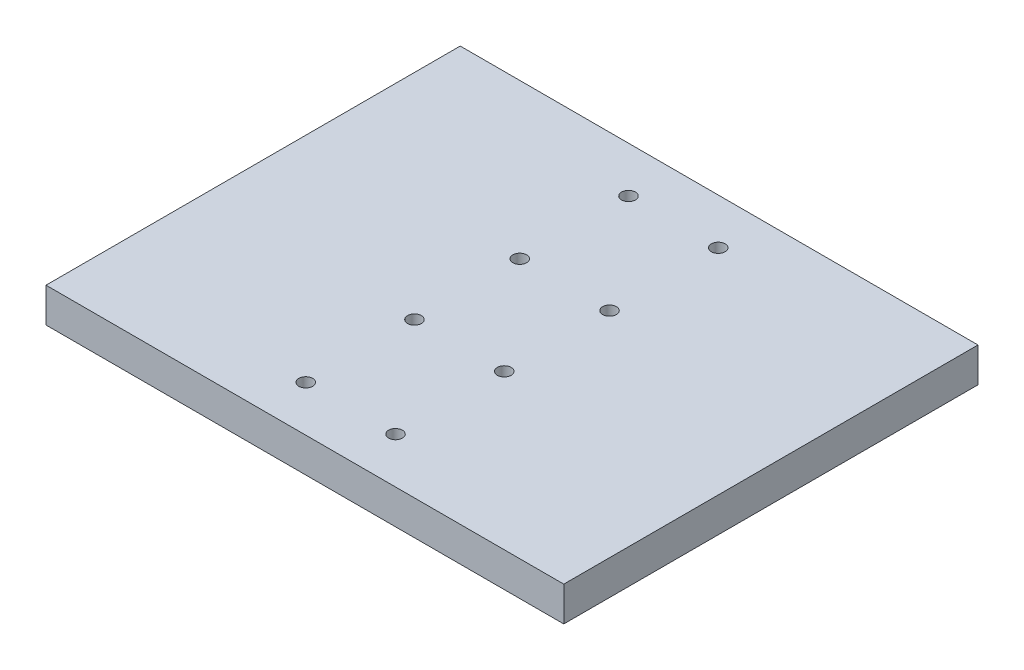
ISO-10303-21;
HEADER;
FILE_DESCRIPTION(('STEP AP214'),'2;1');
FILE_NAME('part.step','',(''),(''),'','','');
FILE_SCHEMA(('AUTOMOTIVE_DESIGN { 1 0 10303 214 1 1 1 1 }'));
ENDSEC;
DATA;
#1=APPLICATION_CONTEXT('core data for automotive mechanical design processes');
#2=APPLICATION_PROTOCOL_DEFINITION('international standard','automotive_design',2000,#1);
#3=PRODUCT_CONTEXT('',#1,'mechanical');
#4=PRODUCT('Part','Part','',(#3));
#5=PRODUCT_RELATED_PRODUCT_CATEGORY('part','',(#4));
#6=PRODUCT_DEFINITION_FORMATION('','',#4);
#7=PRODUCT_DEFINITION_CONTEXT('part definition',#1,'design');
#8=PRODUCT_DEFINITION('design','',#6,#7);
#9=PRODUCT_DEFINITION_SHAPE('','',#8);
#10=(LENGTH_UNIT() NAMED_UNIT(*) SI_UNIT(.MILLI.,.METRE.));
#11=(NAMED_UNIT(*) PLANE_ANGLE_UNIT() SI_UNIT($,.RADIAN.));
#12=(NAMED_UNIT(*) SI_UNIT($,.STERADIAN.) SOLID_ANGLE_UNIT());
#13=UNCERTAINTY_MEASURE_WITH_UNIT(LENGTH_MEASURE(1.E-05),#10,'distance_accuracy_value','');
#14=(GEOMETRIC_REPRESENTATION_CONTEXT(3) GLOBAL_UNCERTAINTY_ASSIGNED_CONTEXT((#13)) GLOBAL_UNIT_ASSIGNED_CONTEXT((#10,
#11,#12)) REPRESENTATION_CONTEXT('',''));
#15=CARTESIAN_POINT('',(0.,0.,0.));
#16=DIRECTION('',(0.,0.,1.));
#17=DIRECTION('',(1.,0.,0.));
#18=AXIS2_PLACEMENT_3D('',#15,#16,#17);
#19=CARTESIAN_POINT('',(0.,10.,0.));
#20=DIRECTION('',(0.,-1.,0.));
#21=DIRECTION('',(0.,0.,-1.));
#22=AXIS2_PLACEMENT_3D('',#19,#20,#21);
#23=PLANE('',#22);
#24=DIRECTION('',(0.,0.,-1.));
#25=VECTOR('',#24,1.);
#26=CARTESIAN_POINT('',(75.,10.,60.));
#27=LINE('',#26,#25);
#28=CARTESIAN_POINT('',(75.,10.,60.));
#29=VERTEX_POINT('',#28);
#30=CARTESIAN_POINT('',(75.,10.,-60.));
#31=VERTEX_POINT('',#30);
#32=EDGE_CURVE('E85',#29,#31,#27,.T.);
#33=ORIENTED_EDGE('',*,*,#32,.T.);
#34=DIRECTION('',(-1.,0.,0.));
#35=VECTOR('',#34,1.);
#36=CARTESIAN_POINT('',(-75.,10.,-60.));
#37=LINE('',#36,#35);
#38=CARTESIAN_POINT('',(-75.,10.,-60.));
#39=VERTEX_POINT('',#38);
#40=EDGE_CURVE('E80',#31,#39,#37,.T.);
#41=ORIENTED_EDGE('',*,*,#40,.T.);
#42=DIRECTION('',(0.,0.,1.));
#43=VECTOR('',#42,1.);
#44=CARTESIAN_POINT('',(-75.,10.,60.));
#45=LINE('',#44,#43);
#46=CARTESIAN_POINT('',(-75.,10.,60.));
#47=VERTEX_POINT('',#46);
#48=EDGE_CURVE('E83',#39,#47,#45,.T.);
#49=ORIENTED_EDGE('',*,*,#48,.T.);
#50=DIRECTION('',(1.,0.,0.));
#51=VECTOR('',#50,1.);
#52=CARTESIAN_POINT('',(-75.,10.,60.));
#53=LINE('',#52,#51);
#54=EDGE_CURVE('E50',#47,#29,#53,.T.);
#55=ORIENTED_EDGE('',*,*,#54,.T.);
#56=EDGE_LOOP('',(#33,#41,#49,#55));
#57=FACE_BOUND('',#56,.T.);
#58=CARTESIAN_POINT('',(-13.,10.,-46.75));
#59=DIRECTION('',(0.,1.,0.));
#60=DIRECTION('',(0.,0.,1.));
#61=AXIS2_PLACEMENT_3D('',#58,#59,#60);
#62=CIRCLE('',#61,2.00000000000001);
#63=CARTESIAN_POINT('',(-13.,10.,-44.75));
#64=VERTEX_POINT('',#63);
#65=EDGE_CURVE('E100',#64,#64,#62,.T.);
#66=ORIENTED_EDGE('',*,*,#65,.F.);
#67=EDGE_LOOP('',(#66));
#68=FACE_BOUND('',#67,.T.);
#69=CARTESIAN_POINT('',(13.,10.,-46.75));
#70=DIRECTION('',(0.,1.,0.));
#71=DIRECTION('',(0.,0.,1.));
#72=AXIS2_PLACEMENT_3D('',#69,#70,#71);
#73=CIRCLE('',#72,2.00000000000001);
#74=CARTESIAN_POINT('',(13.,10.,-44.75));
#75=VERTEX_POINT('',#74);
#76=EDGE_CURVE('E115',#75,#75,#73,.T.);
#77=ORIENTED_EDGE('',*,*,#76,.F.);
#78=EDGE_LOOP('',(#77));
#79=FACE_BOUND('',#78,.T.);
#80=CARTESIAN_POINT('',(13.,10.,-15.25));
#81=DIRECTION('',(0.,1.,0.));
#82=DIRECTION('',(0.,0.,1.));
#83=AXIS2_PLACEMENT_3D('',#80,#81,#82);
#84=CIRCLE('',#83,2.00000000000001);
#85=CARTESIAN_POINT('',(13.,10.,-13.25));
#86=VERTEX_POINT('',#85);
#87=EDGE_CURVE('E121',#86,#86,#84,.T.);
#88=ORIENTED_EDGE('',*,*,#87,.F.);
#89=EDGE_LOOP('',(#88));
#90=FACE_BOUND('',#89,.T.);
#91=CARTESIAN_POINT('',(-13.,10.,-15.25));
#92=DIRECTION('',(0.,1.,0.));
#93=DIRECTION('',(0.,0.,1.));
#94=AXIS2_PLACEMENT_3D('',#91,#92,#93);
#95=CIRCLE('',#94,2.00000000000001);
#96=CARTESIAN_POINT('',(-13.,10.,-13.25));
#97=VERTEX_POINT('',#96);
#98=EDGE_CURVE('E127',#97,#97,#95,.T.);
#99=ORIENTED_EDGE('',*,*,#98,.F.);
#100=EDGE_LOOP('',(#99));
#101=FACE_BOUND('',#100,.T.);
#102=CARTESIAN_POINT('',(-13.,10.,15.25));
#103=DIRECTION('',(0.,1.,0.));
#104=DIRECTION('',(0.,0.,1.));
#105=AXIS2_PLACEMENT_3D('',#102,#103,#104);
#106=CIRCLE('',#105,2.);
#107=CARTESIAN_POINT('',(-13.,10.,17.25));
#108=VERTEX_POINT('',#107);
#109=EDGE_CURVE('E133',#108,#108,#106,.T.);
#110=ORIENTED_EDGE('',*,*,#109,.F.);
#111=EDGE_LOOP('',(#110));
#112=FACE_BOUND('',#111,.T.);
#113=CARTESIAN_POINT('',(13.,10.,15.25));
#114=DIRECTION('',(0.,1.,0.));
#115=DIRECTION('',(0.,0.,1.));
#116=AXIS2_PLACEMENT_3D('',#113,#114,#115);
#117=CIRCLE('',#116,2.);
#118=CARTESIAN_POINT('',(13.,10.,17.25));
#119=VERTEX_POINT('',#118);
#120=EDGE_CURVE('E139',#119,#119,#117,.T.);
#121=ORIENTED_EDGE('',*,*,#120,.F.);
#122=EDGE_LOOP('',(#121));
#123=FACE_BOUND('',#122,.T.);
#124=CARTESIAN_POINT('',(13.,10.,46.75));
#125=DIRECTION('',(0.,1.,0.));
#126=DIRECTION('',(0.,0.,1.));
#127=AXIS2_PLACEMENT_3D('',#124,#125,#126);
#128=CIRCLE('',#127,2.);
#129=CARTESIAN_POINT('',(13.,10.,48.75));
#130=VERTEX_POINT('',#129);
#131=EDGE_CURVE('E145',#130,#130,#128,.T.);
#132=ORIENTED_EDGE('',*,*,#131,.F.);
#133=EDGE_LOOP('',(#132));
#134=FACE_BOUND('',#133,.T.);
#135=CARTESIAN_POINT('',(-13.,10.,46.75));
#136=DIRECTION('',(0.,1.,0.));
#137=DIRECTION('',(0.,0.,1.));
#138=AXIS2_PLACEMENT_3D('',#135,#136,#137);
#139=CIRCLE('',#138,2.00000000000001);
#140=CARTESIAN_POINT('',(-13.,10.,48.75));
#141=VERTEX_POINT('',#140);
#142=EDGE_CURVE('E151',#141,#141,#139,.T.);
#143=ORIENTED_EDGE('',*,*,#142,.F.);
#144=EDGE_LOOP('',(#143));
#145=FACE_BOUND('',#144,.T.);
#146=ADVANCED_FACE('F33',(#57,#68,#79,#90,#101,#112,#123,#134,#145),#23,.F.);
#147=CARTESIAN_POINT('',(0.,0.,0.));
#148=DIRECTION('',(0.,-1.,0.));
#149=DIRECTION('',(0.,0.,-1.));
#150=AXIS2_PLACEMENT_3D('',#147,#148,#149);
#151=PLANE('',#150);
#152=CARTESIAN_POINT('',(13.,0.,46.75));
#153=DIRECTION('',(0.,1.,0.));
#154=DIRECTION('',(0.,0.,1.));
#155=AXIS2_PLACEMENT_3D('',#152,#153,#154);
#156=CIRCLE('',#155,2.);
#157=CARTESIAN_POINT('',(13.,0.,48.75));
#158=VERTEX_POINT('',#157);
#159=EDGE_CURVE('E148',#158,#158,#156,.T.);
#160=ORIENTED_EDGE('',*,*,#159,.T.);
#161=EDGE_LOOP('',(#160));
#162=FACE_BOUND('',#161,.T.);
#163=CARTESIAN_POINT('',(-13.,0.,15.25));
#164=DIRECTION('',(0.,1.,0.));
#165=DIRECTION('',(0.,0.,1.));
#166=AXIS2_PLACEMENT_3D('',#163,#164,#165);
#167=CIRCLE('',#166,2.);
#168=CARTESIAN_POINT('',(-13.,0.,17.25));
#169=VERTEX_POINT('',#168);
#170=EDGE_CURVE('E136',#169,#169,#167,.T.);
#171=ORIENTED_EDGE('',*,*,#170,.T.);
#172=EDGE_LOOP('',(#171));
#173=FACE_BOUND('',#172,.T.);
#174=CARTESIAN_POINT('',(13.,0.,-15.25));
#175=DIRECTION('',(0.,1.,0.));
#176=DIRECTION('',(0.,0.,1.));
#177=AXIS2_PLACEMENT_3D('',#174,#175,#176);
#178=CIRCLE('',#177,2.00000000000001);
#179=CARTESIAN_POINT('',(13.,0.,-13.25));
#180=VERTEX_POINT('',#179);
#181=EDGE_CURVE('E124',#180,#180,#178,.T.);
#182=ORIENTED_EDGE('',*,*,#181,.T.);
#183=EDGE_LOOP('',(#182));
#184=FACE_BOUND('',#183,.T.);
#185=CARTESIAN_POINT('',(-13.,0.,-46.75));
#186=DIRECTION('',(0.,1.,0.));
#187=DIRECTION('',(0.,0.,1.));
#188=AXIS2_PLACEMENT_3D('',#185,#186,#187);
#189=CIRCLE('',#188,2.00000000000001);
#190=CARTESIAN_POINT('',(-13.,0.,-44.75));
#191=VERTEX_POINT('',#190);
#192=EDGE_CURVE('E112',#191,#191,#189,.T.);
#193=ORIENTED_EDGE('',*,*,#192,.T.);
#194=EDGE_LOOP('',(#193));
#195=FACE_BOUND('',#194,.T.);
#196=DIRECTION('',(0.,0.,-1.));
#197=VECTOR('',#196,1.);
#198=CARTESIAN_POINT('',(75.,0.,60.));
#199=LINE('',#198,#197);
#200=CARTESIAN_POINT('',(75.,0.,60.));
#201=VERTEX_POINT('',#200);
#202=CARTESIAN_POINT('',(75.,0.,-60.));
#203=VERTEX_POINT('',#202);
#204=EDGE_CURVE('E97',#201,#203,#199,.T.);
#205=ORIENTED_EDGE('',*,*,#204,.F.);
#206=DIRECTION('',(1.,0.,0.));
#207=VECTOR('',#206,1.);
#208=CARTESIAN_POINT('',(-75.,0.,60.));
#209=LINE('',#208,#207);
#210=CARTESIAN_POINT('',(-75.,0.,60.));
#211=VERTEX_POINT('',#210);
#212=EDGE_CURVE('E73',#211,#201,#209,.T.);
#213=ORIENTED_EDGE('',*,*,#212,.F.);
#214=DIRECTION('',(0.,0.,1.));
#215=VECTOR('',#214,1.);
#216=CARTESIAN_POINT('',(-75.,0.,60.));
#217=LINE('',#216,#215);
#218=CARTESIAN_POINT('',(-75.,0.,-60.));
#219=VERTEX_POINT('',#218);
#220=EDGE_CURVE('E67',#219,#211,#217,.T.);
#221=ORIENTED_EDGE('',*,*,#220,.F.);
#222=DIRECTION('',(-1.,0.,0.));
#223=VECTOR('',#222,1.);
#224=CARTESIAN_POINT('',(-75.,0.,-60.));
#225=LINE('',#224,#223);
#226=EDGE_CURVE('E89',#203,#219,#225,.T.);
#227=ORIENTED_EDGE('',*,*,#226,.F.);
#228=EDGE_LOOP('',(#205,#213,#221,#227));
#229=FACE_BOUND('',#228,.T.);
#230=CARTESIAN_POINT('',(13.,0.,-46.75));
#231=DIRECTION('',(0.,1.,0.));
#232=DIRECTION('',(0.,0.,1.));
#233=AXIS2_PLACEMENT_3D('',#230,#231,#232);
#234=CIRCLE('',#233,2.00000000000001);
#235=CARTESIAN_POINT('',(13.,0.,-44.75));
#236=VERTEX_POINT('',#235);
#237=EDGE_CURVE('E118',#236,#236,#234,.T.);
#238=ORIENTED_EDGE('',*,*,#237,.T.);
#239=EDGE_LOOP('',(#238));
#240=FACE_BOUND('',#239,.T.);
#241=CARTESIAN_POINT('',(-13.,0.,-15.25));
#242=DIRECTION('',(0.,1.,0.));
#243=DIRECTION('',(0.,0.,1.));
#244=AXIS2_PLACEMENT_3D('',#241,#242,#243);
#245=CIRCLE('',#244,2.00000000000001);
#246=CARTESIAN_POINT('',(-13.,0.,-13.25));
#247=VERTEX_POINT('',#246);
#248=EDGE_CURVE('E130',#247,#247,#245,.T.);
#249=ORIENTED_EDGE('',*,*,#248,.T.);
#250=EDGE_LOOP('',(#249));
#251=FACE_BOUND('',#250,.T.);
#252=CARTESIAN_POINT('',(13.,0.,15.25));
#253=DIRECTION('',(0.,1.,0.));
#254=DIRECTION('',(0.,0.,1.));
#255=AXIS2_PLACEMENT_3D('',#252,#253,#254);
#256=CIRCLE('',#255,2.);
#257=CARTESIAN_POINT('',(13.,0.,17.25));
#258=VERTEX_POINT('',#257);
#259=EDGE_CURVE('E142',#258,#258,#256,.T.);
#260=ORIENTED_EDGE('',*,*,#259,.T.);
#261=EDGE_LOOP('',(#260));
#262=FACE_BOUND('',#261,.T.);
#263=CARTESIAN_POINT('',(-13.,0.,46.75));
#264=DIRECTION('',(0.,1.,0.));
#265=DIRECTION('',(0.,0.,1.));
#266=AXIS2_PLACEMENT_3D('',#263,#264,#265);
#267=CIRCLE('',#266,2.00000000000001);
#268=CARTESIAN_POINT('',(-13.,0.,48.75));
#269=VERTEX_POINT('',#268);
#270=EDGE_CURVE('E154',#269,#269,#267,.T.);
#271=ORIENTED_EDGE('',*,*,#270,.T.);
#272=EDGE_LOOP('',(#271));
#273=FACE_BOUND('',#272,.T.);
#274=ADVANCED_FACE('F108',(#162,#173,#184,#195,#229,#240,#251,#262,#273),#151,.T.);
#275=CARTESIAN_POINT('',(75.,10.,60.));
#276=DIRECTION('',(-1.,0.,0.));
#277=DIRECTION('',(0.,0.,1.));
#278=AXIS2_PLACEMENT_3D('',#275,#276,#277);
#279=PLANE('',#278);
#280=ORIENTED_EDGE('',*,*,#204,.T.);
#281=DIRECTION('',(0.,-1.,0.));
#282=VECTOR('',#281,1.);
#283=CARTESIAN_POINT('',(75.,10.,-60.));
#284=LINE('',#283,#282);
#285=EDGE_CURVE('E11',#31,#203,#284,.T.);
#286=ORIENTED_EDGE('',*,*,#285,.F.);
#287=ORIENTED_EDGE('',*,*,#32,.F.);
#288=DIRECTION('',(0.,-1.,0.));
#289=VECTOR('',#288,1.);
#290=CARTESIAN_POINT('',(75.,10.,60.));
#291=LINE('',#290,#289);
#292=EDGE_CURVE('E93',#29,#201,#291,.T.);
#293=ORIENTED_EDGE('',*,*,#292,.T.);
#294=EDGE_LOOP('',(#280,#286,#287,#293));
#295=FACE_BOUND('',#294,.T.);
#296=ADVANCED_FACE('F35',(#295),#279,.F.);
#297=CARTESIAN_POINT('',(-75.,10.,-60.));
#298=DIRECTION('',(0.,0.,1.));
#299=DIRECTION('',(1.,0.,0.));
#300=AXIS2_PLACEMENT_3D('',#297,#298,#299);
#301=PLANE('',#300);
#302=ORIENTED_EDGE('',*,*,#226,.T.);
#303=DIRECTION('',(0.,-1.,0.));
#304=VECTOR('',#303,1.);
#305=CARTESIAN_POINT('',(-75.,10.,-60.));
#306=LINE('',#305,#304);
#307=EDGE_CURVE('E42',#39,#219,#306,.T.);
#308=ORIENTED_EDGE('',*,*,#307,.F.);
#309=ORIENTED_EDGE('',*,*,#40,.F.);
#310=ORIENTED_EDGE('',*,*,#285,.T.);
#311=EDGE_LOOP('',(#302,#308,#309,#310));
#312=FACE_BOUND('',#311,.T.);
#313=ADVANCED_FACE('F88',(#312),#301,.F.);
#314=CARTESIAN_POINT('',(-75.,10.,60.));
#315=DIRECTION('',(1.,0.,0.));
#316=DIRECTION('',(0.,0.,-1.));
#317=AXIS2_PLACEMENT_3D('',#314,#315,#316);
#318=PLANE('',#317);
#319=ORIENTED_EDGE('',*,*,#220,.T.);
#320=DIRECTION('',(0.,-1.,0.));
#321=VECTOR('',#320,1.);
#322=CARTESIAN_POINT('',(-75.,10.,60.));
#323=LINE('',#322,#321);
#324=EDGE_CURVE('E90',#47,#211,#323,.T.);
#325=ORIENTED_EDGE('',*,*,#324,.F.);
#326=ORIENTED_EDGE('',*,*,#48,.F.);
#327=ORIENTED_EDGE('',*,*,#307,.T.);
#328=EDGE_LOOP('',(#319,#325,#326,#327));
#329=FACE_BOUND('',#328,.T.);
#330=ADVANCED_FACE('F91',(#329),#318,.F.);
#331=CARTESIAN_POINT('',(-75.,10.,60.));
#332=DIRECTION('',(0.,0.,-1.));
#333=DIRECTION('',(-1.,0.,0.));
#334=AXIS2_PLACEMENT_3D('',#331,#332,#333);
#335=PLANE('',#334);
#336=ORIENTED_EDGE('',*,*,#212,.T.);
#337=ORIENTED_EDGE('',*,*,#292,.F.);
#338=ORIENTED_EDGE('',*,*,#54,.F.);
#339=ORIENTED_EDGE('',*,*,#324,.T.);
#340=EDGE_LOOP('',(#336,#337,#338,#339));
#341=FACE_BOUND('',#340,.T.);
#342=ADVANCED_FACE('F105',(#341),#335,.F.);
#343=CARTESIAN_POINT('',(-13.,10.,-46.75));
#344=DIRECTION('',(0.,-1.,0.));
#345=DIRECTION('',(0.,0.,-1.));
#346=AXIS2_PLACEMENT_3D('',#343,#344,#345);
#347=CYLINDRICAL_SURFACE('',#346,2.00000000000001);
#348=ORIENTED_EDGE('',*,*,#65,.T.);
#349=EDGE_LOOP('',(#348));
#350=FACE_BOUND('',#349,.T.);
#351=ORIENTED_EDGE('',*,*,#192,.F.);
#352=EDGE_LOOP('',(#351));
#353=FACE_BOUND('',#352,.T.);
#354=ADVANCED_FACE('F171',(#350,#353),#347,.F.);
#355=CARTESIAN_POINT('',(13.,10.,-46.75));
#356=DIRECTION('',(0.,-1.,0.));
#357=DIRECTION('',(0.,0.,-1.));
#358=AXIS2_PLACEMENT_3D('',#355,#356,#357);
#359=CYLINDRICAL_SURFACE('',#358,2.00000000000001);
#360=ORIENTED_EDGE('',*,*,#76,.T.);
#361=EDGE_LOOP('',(#360));
#362=FACE_BOUND('',#361,.T.);
#363=ORIENTED_EDGE('',*,*,#237,.F.);
#364=EDGE_LOOP('',(#363));
#365=FACE_BOUND('',#364,.T.);
#366=ADVANCED_FACE('F217',(#362,#365),#359,.F.);
#367=CARTESIAN_POINT('',(13.,10.,-15.25));
#368=DIRECTION('',(0.,-1.,0.));
#369=DIRECTION('',(0.,0.,-1.));
#370=AXIS2_PLACEMENT_3D('',#367,#368,#369);
#371=CYLINDRICAL_SURFACE('',#370,2.00000000000001);
#372=ORIENTED_EDGE('',*,*,#87,.T.);
#373=EDGE_LOOP('',(#372));
#374=FACE_BOUND('',#373,.T.);
#375=ORIENTED_EDGE('',*,*,#181,.F.);
#376=EDGE_LOOP('',(#375));
#377=FACE_BOUND('',#376,.T.);
#378=ADVANCED_FACE('F225',(#374,#377),#371,.F.);
#379=CARTESIAN_POINT('',(-13.,10.,-15.25));
#380=DIRECTION('',(0.,-1.,0.));
#381=DIRECTION('',(0.,0.,-1.));
#382=AXIS2_PLACEMENT_3D('',#379,#380,#381);
#383=CYLINDRICAL_SURFACE('',#382,2.00000000000001);
#384=ORIENTED_EDGE('',*,*,#98,.T.);
#385=EDGE_LOOP('',(#384));
#386=FACE_BOUND('',#385,.T.);
#387=ORIENTED_EDGE('',*,*,#248,.F.);
#388=EDGE_LOOP('',(#387));
#389=FACE_BOUND('',#388,.T.);
#390=ADVANCED_FACE('F233',(#386,#389),#383,.F.);
#391=CARTESIAN_POINT('',(-13.,10.,15.25));
#392=DIRECTION('',(0.,-1.,0.));
#393=DIRECTION('',(0.,0.,-1.));
#394=AXIS2_PLACEMENT_3D('',#391,#392,#393);
#395=CYLINDRICAL_SURFACE('',#394,2.);
#396=ORIENTED_EDGE('',*,*,#109,.T.);
#397=EDGE_LOOP('',(#396));
#398=FACE_BOUND('',#397,.T.);
#399=ORIENTED_EDGE('',*,*,#170,.F.);
#400=EDGE_LOOP('',(#399));
#401=FACE_BOUND('',#400,.T.);
#402=ADVANCED_FACE('F242',(#398,#401),#395,.F.);
#403=CARTESIAN_POINT('',(13.,10.,15.25));
#404=DIRECTION('',(0.,-1.,0.));
#405=DIRECTION('',(0.,0.,-1.));
#406=AXIS2_PLACEMENT_3D('',#403,#404,#405);
#407=CYLINDRICAL_SURFACE('',#406,2.);
#408=ORIENTED_EDGE('',*,*,#120,.T.);
#409=EDGE_LOOP('',(#408));
#410=FACE_BOUND('',#409,.T.);
#411=ORIENTED_EDGE('',*,*,#259,.F.);
#412=EDGE_LOOP('',(#411));
#413=FACE_BOUND('',#412,.T.);
#414=ADVANCED_FACE('F251',(#410,#413),#407,.F.);
#415=CARTESIAN_POINT('',(13.,10.,46.75));
#416=DIRECTION('',(0.,-1.,0.));
#417=DIRECTION('',(0.,0.,-1.));
#418=AXIS2_PLACEMENT_3D('',#415,#416,#417);
#419=CYLINDRICAL_SURFACE('',#418,2.);
#420=ORIENTED_EDGE('',*,*,#131,.T.);
#421=EDGE_LOOP('',(#420));
#422=FACE_BOUND('',#421,.T.);
#423=ORIENTED_EDGE('',*,*,#159,.F.);
#424=EDGE_LOOP('',(#423));
#425=FACE_BOUND('',#424,.T.);
#426=ADVANCED_FACE('F260',(#422,#425),#419,.F.);
#427=CARTESIAN_POINT('',(-13.,10.,46.75));
#428=DIRECTION('',(0.,-1.,0.));
#429=DIRECTION('',(0.,0.,-1.));
#430=AXIS2_PLACEMENT_3D('',#427,#428,#429);
#431=CYLINDRICAL_SURFACE('',#430,2.00000000000001);
#432=ORIENTED_EDGE('',*,*,#142,.T.);
#433=EDGE_LOOP('',(#432));
#434=FACE_BOUND('',#433,.T.);
#435=ORIENTED_EDGE('',*,*,#270,.F.);
#436=EDGE_LOOP('',(#435));
#437=FACE_BOUND('',#436,.T.);
#438=ADVANCED_FACE('F160',(#434,#437),#431,.F.);
#439=CLOSED_SHELL('',(#146,#274,#296,#313,#330,#342,#354,#366,#378,#390,#402,#414,#426,#438));
#440=MANIFOLD_SOLID_BREP('B2',#439);
#441=ADVANCED_BREP_SHAPE_REPRESENTATION('',(#18,#440),#14);
#442=SHAPE_DEFINITION_REPRESENTATION(#9,#441);
ENDSEC;
END-ISO-10303-21;
